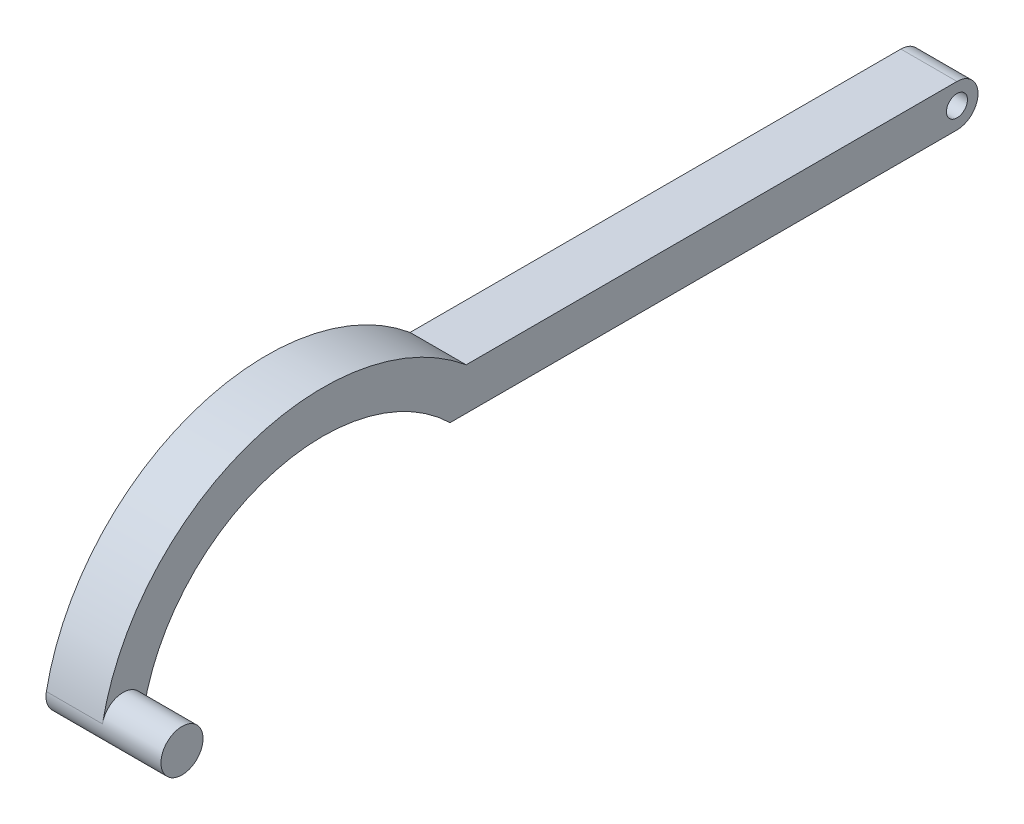
ISO-10303-21;
HEADER;
FILE_DESCRIPTION(('STEP AP214'),'2;1');
FILE_NAME('part.step','',(''),(''),'','','');
FILE_SCHEMA(('AUTOMOTIVE_DESIGN { 1 0 10303 214 1 1 1 1 }'));
ENDSEC;
DATA;
#1=APPLICATION_CONTEXT('core data for automotive mechanical design processes');
#2=APPLICATION_PROTOCOL_DEFINITION('international standard','automotive_design',2000,#1);
#3=PRODUCT_CONTEXT('',#1,'mechanical');
#4=PRODUCT('Part','Part','',(#3));
#5=PRODUCT_RELATED_PRODUCT_CATEGORY('part','',(#4));
#6=PRODUCT_DEFINITION_FORMATION('','',#4);
#7=PRODUCT_DEFINITION_CONTEXT('part definition',#1,'design');
#8=PRODUCT_DEFINITION('design','',#6,#7);
#9=PRODUCT_DEFINITION_SHAPE('','',#8);
#10=(LENGTH_UNIT() NAMED_UNIT(*) SI_UNIT(.MILLI.,.METRE.));
#11=(NAMED_UNIT(*) PLANE_ANGLE_UNIT() SI_UNIT($,.RADIAN.));
#12=(NAMED_UNIT(*) SI_UNIT($,.STERADIAN.) SOLID_ANGLE_UNIT());
#13=UNCERTAINTY_MEASURE_WITH_UNIT(LENGTH_MEASURE(1.E-05),#10,'distance_accuracy_value','');
#14=(GEOMETRIC_REPRESENTATION_CONTEXT(3) GLOBAL_UNCERTAINTY_ASSIGNED_CONTEXT((#13)) GLOBAL_UNIT_ASSIGNED_CONTEXT((#10,
#11,#12)) REPRESENTATION_CONTEXT('',''));
#15=CARTESIAN_POINT('',(0.,0.,0.));
#16=DIRECTION('',(0.,0.,1.));
#17=DIRECTION('',(1.,0.,0.));
#18=AXIS2_PLACEMENT_3D('',#15,#16,#17);
#19=CARTESIAN_POINT('',(4.,-2.79685503450136,-14.2277054339758));
#20=DIRECTION('',(1.,0.,0.));
#21=DIRECTION('',(0.,0.,-1.));
#22=AXIS2_PLACEMENT_3D('',#19,#20,#21);
#23=PLANE('',#22);
#24=CARTESIAN_POINT('',(4.,0.,0.));
#25=DIRECTION('',(1.,0.,0.));
#26=DIRECTION('',(0.,0.,-1.));
#27=AXIS2_PLACEMENT_3D('',#24,#25,#26);
#28=CIRCLE('',#27,1.5);
#29=CARTESIAN_POINT('',(4.,-0.289329826964419,-1.47183159744203));
#30=VERTEX_POINT('',#29);
#31=CARTESIAN_POINT('',(4.,0.289329831155314,1.47183159661819));
#32=VERTEX_POINT('',#31);
#33=EDGE_CURVE('E11',#30,#32,#28,.T.);
#34=ORIENTED_EDGE('',*,*,#33,.F.);
#35=CARTESIAN_POINT('',(4.,-2.79685503450136,-14.2277054339758));
#36=DIRECTION('',(-1.,0.,0.));
#37=DIRECTION('',(0.,0.,1.));
#38=AXIS2_PLACEMENT_3D('',#35,#36,#37);
#39=CIRCLE('',#38,13.);
#40=CARTESIAN_POINT('',(4.,6.49999999999999,-23.3144257701294));
#41=VERTEX_POINT('',#40);
#42=EDGE_CURVE('E98',#30,#41,#39,.T.);
#43=ORIENTED_EDGE('',*,*,#42,.T.);
#44=DIRECTION('',(0.,0.,-1.));
#45=VECTOR('',#44,1.);
#46=CARTESIAN_POINT('',(4.,6.5,-59.464274989274));
#47=LINE('',#46,#45);
#48=CARTESIAN_POINT('',(4.,6.5,-59.464274989274));
#49=VERTEX_POINT('',#48);
#50=EDGE_CURVE('E92',#41,#49,#47,.T.);
#51=ORIENTED_EDGE('',*,*,#50,.T.);
#52=CARTESIAN_POINT('',(4.,8.,-59.464274989274));
#53=DIRECTION('',(1.,0.,0.));
#54=DIRECTION('',(0.,0.,-1.));
#55=AXIS2_PLACEMENT_3D('',#52,#53,#54);
#56=CIRCLE('',#55,1.5);
#57=CARTESIAN_POINT('',(4.,9.5,-59.464274989274));
#58=VERTEX_POINT('',#57);
#59=EDGE_CURVE('E96',#49,#58,#56,.T.);
#60=ORIENTED_EDGE('',*,*,#59,.T.);
#61=DIRECTION('',(0.,0.,1.));
#62=VECTOR('',#61,1.);
#63=CARTESIAN_POINT('',(4.,9.5,-59.464274989274));
#64=LINE('',#63,#62);
#65=CARTESIAN_POINT('',(4.,9.5,-24.464274989274));
#66=VERTEX_POINT('',#65);
#67=EDGE_CURVE('E51',#58,#66,#64,.T.);
#68=ORIENTED_EDGE('',*,*,#67,.T.);
#69=CARTESIAN_POINT('',(4.,-2.79685503450136,-14.2277054339758));
#70=DIRECTION('',(1.,0.,0.));
#71=DIRECTION('',(0.,0.,-1.));
#72=AXIS2_PLACEMENT_3D('',#69,#70,#71);
#73=CIRCLE('',#72,16.);
#74=EDGE_CURVE('E127',#66,#32,#73,.T.);
#75=ORIENTED_EDGE('',*,*,#74,.T.);
#76=EDGE_LOOP('',(#34,#43,#51,#60,#68,#75));
#77=FACE_BOUND('',#76,.T.);
#78=CARTESIAN_POINT('',(4.,8.,-59.464274989274));
#79=DIRECTION('',(1.,0.,0.));
#80=DIRECTION('',(0.,0.,-1.));
#81=AXIS2_PLACEMENT_3D('',#78,#79,#80);
#82=CIRCLE('',#81,0.749999999999999);
#83=CARTESIAN_POINT('',(4.,8.,-60.214274989274));
#84=VERTEX_POINT('',#83);
#85=EDGE_CURVE('E120',#84,#84,#82,.T.);
#86=ORIENTED_EDGE('',*,*,#85,.F.);
#87=EDGE_LOOP('',(#86));
#88=FACE_BOUND('',#87,.T.);
#89=ADVANCED_FACE('F33',(#77,#88),#23,.T.);
#90=CARTESIAN_POINT('',(0.,-2.79685503450136,-14.2277054339758));
#91=DIRECTION('',(1.,0.,0.));
#92=DIRECTION('',(0.,0.,-1.));
#93=AXIS2_PLACEMENT_3D('',#90,#91,#92);
#94=PLANE('',#93);
#95=CARTESIAN_POINT('',(0.,-2.79685503450136,-14.2277054339758));
#96=DIRECTION('',(1.,0.,0.));
#97=DIRECTION('',(0.,0.,-1.));
#98=AXIS2_PLACEMENT_3D('',#95,#96,#97);
#99=CIRCLE('',#98,16.);
#100=CARTESIAN_POINT('',(0.,9.5,-24.464274989274));
#101=VERTEX_POINT('',#100);
#102=CARTESIAN_POINT('',(0.,0.289329831155314,1.47183159661819));
#103=VERTEX_POINT('',#102);
#104=EDGE_CURVE('E116',#101,#103,#99,.T.);
#105=ORIENTED_EDGE('',*,*,#104,.F.);
#106=DIRECTION('',(0.,0.,1.));
#107=VECTOR('',#106,1.);
#108=CARTESIAN_POINT('',(0.,9.5,-59.464274989274));
#109=LINE('',#108,#107);
#110=CARTESIAN_POINT('',(0.,9.5,-59.464274989274));
#111=VERTEX_POINT('',#110);
#112=EDGE_CURVE('E81',#111,#101,#109,.T.);
#113=ORIENTED_EDGE('',*,*,#112,.F.);
#114=CARTESIAN_POINT('',(0.,8.,-59.464274989274));
#115=DIRECTION('',(1.,0.,0.));
#116=DIRECTION('',(0.,0.,-1.));
#117=AXIS2_PLACEMENT_3D('',#114,#115,#116);
#118=CIRCLE('',#117,1.5);
#119=CARTESIAN_POINT('',(0.,6.5,-59.464274989274));
#120=VERTEX_POINT('',#119);
#121=EDGE_CURVE('E75',#120,#111,#118,.T.);
#122=ORIENTED_EDGE('',*,*,#121,.F.);
#123=DIRECTION('',(0.,0.,-1.));
#124=VECTOR('',#123,1.);
#125=CARTESIAN_POINT('',(0.,6.5,-59.464274989274));
#126=LINE('',#125,#124);
#127=CARTESIAN_POINT('',(0.,6.49999999999999,-23.3144257701294));
#128=VERTEX_POINT('',#127);
#129=EDGE_CURVE('E106',#128,#120,#126,.T.);
#130=ORIENTED_EDGE('',*,*,#129,.F.);
#131=CARTESIAN_POINT('',(0.,-2.79685503450136,-14.2277054339758));
#132=DIRECTION('',(-1.,0.,0.));
#133=DIRECTION('',(0.,0.,1.));
#134=AXIS2_PLACEMENT_3D('',#131,#132,#133);
#135=CIRCLE('',#134,13.);
#136=CARTESIAN_POINT('',(0.,-0.289329826964419,-1.47183159744203));
#137=VERTEX_POINT('',#136);
#138=EDGE_CURVE('E122',#137,#128,#135,.T.);
#139=ORIENTED_EDGE('',*,*,#138,.F.);
#140=CARTESIAN_POINT('',(0.,0.,0.));
#141=DIRECTION('',(1.,0.,0.));
#142=DIRECTION('',(0.,0.,-1.));
#143=AXIS2_PLACEMENT_3D('',#140,#141,#142);
#144=CIRCLE('',#143,1.5);
#145=EDGE_CURVE('E119',#103,#137,#144,.T.);
#146=ORIENTED_EDGE('',*,*,#145,.F.);
#147=EDGE_LOOP('',(#105,#113,#122,#130,#139,#146));
#148=FACE_BOUND('',#147,.T.);
#149=CARTESIAN_POINT('',(0.,8.,-59.464274989274));
#150=DIRECTION('',(1.,0.,0.));
#151=DIRECTION('',(0.,0.,-1.));
#152=AXIS2_PLACEMENT_3D('',#149,#150,#151);
#153=CIRCLE('',#152,0.749999999999999);
#154=CARTESIAN_POINT('',(0.,8.,-60.214274989274));
#155=VERTEX_POINT('',#154);
#156=EDGE_CURVE('E148',#155,#155,#153,.T.);
#157=ORIENTED_EDGE('',*,*,#156,.T.);
#158=EDGE_LOOP('',(#157));
#159=FACE_BOUND('',#158,.T.);
#160=ADVANCED_FACE('F143',(#148,#159),#94,.F.);
#161=CARTESIAN_POINT('',(4.,-2.79685503450136,-14.2277054339758));
#162=DIRECTION('',(-1.,0.,0.));
#163=DIRECTION('',(0.,0.,1.));
#164=AXIS2_PLACEMENT_3D('',#161,#162,#163);
#165=CYLINDRICAL_SURFACE('',#164,16.);
#166=ORIENTED_EDGE('',*,*,#104,.T.);
#167=DIRECTION('',(-1.,0.,0.));
#168=VECTOR('',#167,1.);
#169=CARTESIAN_POINT('',(4.,0.289329831155314,1.47183159661819));
#170=LINE('',#169,#168);
#171=EDGE_CURVE('E37',#32,#103,#170,.T.);
#172=ORIENTED_EDGE('',*,*,#171,.F.);
#173=ORIENTED_EDGE('',*,*,#74,.F.);
#174=DIRECTION('',(-1.,0.,0.));
#175=VECTOR('',#174,1.);
#176=CARTESIAN_POINT('',(4.,9.5,-24.464274989274));
#177=LINE('',#176,#175);
#178=EDGE_CURVE('E112',#66,#101,#177,.T.);
#179=ORIENTED_EDGE('',*,*,#178,.T.);
#180=EDGE_LOOP('',(#166,#172,#173,#179));
#181=FACE_BOUND('',#180,.T.);
#182=ADVANCED_FACE('F35',(#181),#165,.T.);
#183=CARTESIAN_POINT('',(4.,0.,0.));
#184=DIRECTION('',(-1.,0.,0.));
#185=DIRECTION('',(0.,0.,1.));
#186=AXIS2_PLACEMENT_3D('',#183,#184,#185);
#187=CYLINDRICAL_SURFACE('',#186,1.5);
#188=ORIENTED_EDGE('',*,*,#145,.T.);
#189=DIRECTION('',(-1.,0.,0.));
#190=VECTOR('',#189,1.);
#191=CARTESIAN_POINT('',(4.,-0.289329826964419,-1.47183159744203));
#192=LINE('',#191,#190);
#193=EDGE_CURVE('E130',#30,#137,#192,.T.);
#194=ORIENTED_EDGE('',*,*,#193,.F.);
#195=ORIENTED_EDGE('',*,*,#33,.T.);
#196=ORIENTED_EDGE('',*,*,#171,.T.);
#197=EDGE_LOOP('',(#188,#194,#195,#196));
#198=FACE_BOUND('',#197,.T.);
#199=CARTESIAN_POINT('',(8.2,0.,0.));
#200=DIRECTION('',(1.,0.,0.));
#201=DIRECTION('',(0.,0.,-1.));
#202=AXIS2_PLACEMENT_3D('',#199,#200,#201);
#203=CIRCLE('',#202,1.5);
#204=CARTESIAN_POINT('',(8.2,0.,-1.5));
#205=VERTEX_POINT('',#204);
#206=EDGE_CURVE('E151',#205,#205,#203,.T.);
#207=ORIENTED_EDGE('',*,*,#206,.F.);
#208=EDGE_LOOP('',(#207));
#209=FACE_BOUND('',#208,.T.);
#210=ADVANCED_FACE('F137',(#198,#209),#187,.T.);
#211=CARTESIAN_POINT('',(4.,-2.79685503450136,-14.2277054339758));
#212=DIRECTION('',(-1.,0.,0.));
#213=DIRECTION('',(0.,0.,1.));
#214=AXIS2_PLACEMENT_3D('',#211,#212,#213);
#215=CYLINDRICAL_SURFACE('',#214,13.);
#216=ORIENTED_EDGE('',*,*,#138,.T.);
#217=DIRECTION('',(-1.,0.,0.));
#218=VECTOR('',#217,1.);
#219=CARTESIAN_POINT('',(4.,6.49999999999999,-23.3144257701294));
#220=LINE('',#219,#218);
#221=EDGE_CURVE('E107',#41,#128,#220,.T.);
#222=ORIENTED_EDGE('',*,*,#221,.F.);
#223=ORIENTED_EDGE('',*,*,#42,.F.);
#224=ORIENTED_EDGE('',*,*,#193,.T.);
#225=EDGE_LOOP('',(#216,#222,#223,#224));
#226=FACE_BOUND('',#225,.T.);
#227=ADVANCED_FACE('F145',(#226),#215,.F.);
#228=CARTESIAN_POINT('',(4.,6.5,-59.464274989274));
#229=DIRECTION('',(0.,1.,0.));
#230=DIRECTION('',(0.,0.,1.));
#231=AXIS2_PLACEMENT_3D('',#228,#229,#230);
#232=PLANE('',#231);
#233=ORIENTED_EDGE('',*,*,#129,.T.);
#234=DIRECTION('',(-1.,0.,0.));
#235=VECTOR('',#234,1.);
#236=CARTESIAN_POINT('',(4.,6.5,-59.464274989274));
#237=LINE('',#236,#235);
#238=EDGE_CURVE('E103',#49,#120,#237,.T.);
#239=ORIENTED_EDGE('',*,*,#238,.F.);
#240=ORIENTED_EDGE('',*,*,#50,.F.);
#241=ORIENTED_EDGE('',*,*,#221,.T.);
#242=EDGE_LOOP('',(#233,#239,#240,#241));
#243=FACE_BOUND('',#242,.T.);
#244=ADVANCED_FACE('F104',(#243),#232,.F.);
#245=CARTESIAN_POINT('',(4.,8.,-59.464274989274));
#246=DIRECTION('',(-1.,0.,0.));
#247=DIRECTION('',(0.,0.,1.));
#248=AXIS2_PLACEMENT_3D('',#245,#246,#247);
#249=CYLINDRICAL_SURFACE('',#248,1.5);
#250=ORIENTED_EDGE('',*,*,#121,.T.);
#251=DIRECTION('',(-1.,0.,0.));
#252=VECTOR('',#251,1.);
#253=CARTESIAN_POINT('',(4.,9.5,-59.464274989274));
#254=LINE('',#253,#252);
#255=EDGE_CURVE('E108',#58,#111,#254,.T.);
#256=ORIENTED_EDGE('',*,*,#255,.F.);
#257=ORIENTED_EDGE('',*,*,#59,.F.);
#258=ORIENTED_EDGE('',*,*,#238,.T.);
#259=EDGE_LOOP('',(#250,#256,#257,#258));
#260=FACE_BOUND('',#259,.T.);
#261=ADVANCED_FACE('F110',(#260),#249,.T.);
#262=CARTESIAN_POINT('',(4.,9.5,-59.464274989274));
#263=DIRECTION('',(0.,-1.,0.));
#264=DIRECTION('',(0.,0.,-1.));
#265=AXIS2_PLACEMENT_3D('',#262,#263,#264);
#266=PLANE('',#265);
#267=ORIENTED_EDGE('',*,*,#112,.T.);
#268=ORIENTED_EDGE('',*,*,#178,.F.);
#269=ORIENTED_EDGE('',*,*,#67,.F.);
#270=ORIENTED_EDGE('',*,*,#255,.T.);
#271=EDGE_LOOP('',(#267,#268,#269,#270));
#272=FACE_BOUND('',#271,.T.);
#273=ADVANCED_FACE('F174',(#272),#266,.F.);
#274=CARTESIAN_POINT('',(4.,8.,-59.464274989274));
#275=DIRECTION('',(-1.,0.,0.));
#276=DIRECTION('',(0.,0.,1.));
#277=AXIS2_PLACEMENT_3D('',#274,#275,#276);
#278=CYLINDRICAL_SURFACE('',#277,0.749999999999999);
#279=ORIENTED_EDGE('',*,*,#85,.T.);
#280=EDGE_LOOP('',(#279));
#281=FACE_BOUND('',#280,.T.);
#282=ORIENTED_EDGE('',*,*,#156,.F.);
#283=EDGE_LOOP('',(#282));
#284=FACE_BOUND('',#283,.T.);
#285=ADVANCED_FACE('F171',(#281,#284),#278,.F.);
#286=CARTESIAN_POINT('',(8.2,0.,0.));
#287=DIRECTION('',(1.,0.,0.));
#288=DIRECTION('',(0.,0.,-1.));
#289=AXIS2_PLACEMENT_3D('',#286,#287,#288);
#290=PLANE('',#289);
#291=ORIENTED_EDGE('',*,*,#206,.T.);
#292=EDGE_LOOP('',(#291));
#293=FACE_BOUND('',#292,.T.);
#294=ADVANCED_FACE('F157',(#293),#290,.T.);
#295=CLOSED_SHELL('',(#89,#160,#182,#210,#227,#244,#261,#273,#285,#294));
#296=MANIFOLD_SOLID_BREP('B2',#295);
#297=ADVANCED_BREP_SHAPE_REPRESENTATION('',(#18,#296),#14);
#298=SHAPE_DEFINITION_REPRESENTATION(#9,#297);
ENDSEC;
END-ISO-10303-21;
